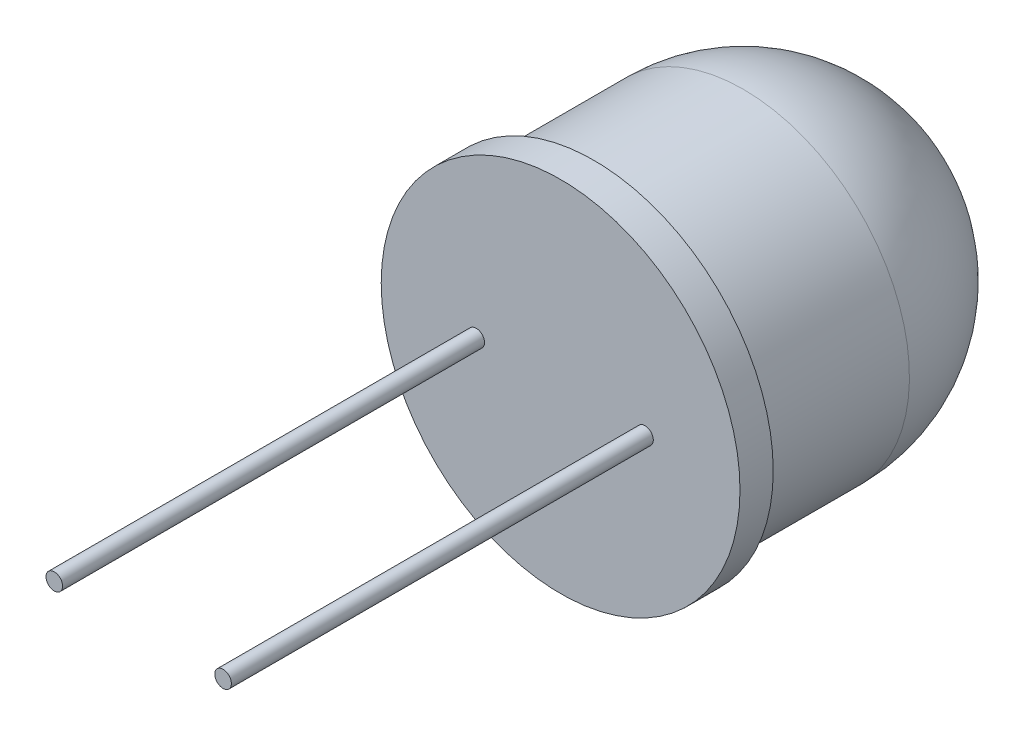
ISO-10303-21;
HEADER;
FILE_DESCRIPTION(('STEP AP214'),'2;1');
FILE_NAME('part.step','',(''),(''),'','','');
FILE_SCHEMA(('AUTOMOTIVE_DESIGN { 1 0 10303 214 1 1 1 1 }'));
ENDSEC;
DATA;
#1=APPLICATION_CONTEXT('core data for automotive mechanical design processes');
#2=APPLICATION_PROTOCOL_DEFINITION('international standard','automotive_design',2000,#1);
#3=PRODUCT_CONTEXT('',#1,'mechanical');
#4=PRODUCT('Part','Part','',(#3));
#5=PRODUCT_RELATED_PRODUCT_CATEGORY('part','',(#4));
#6=PRODUCT_DEFINITION_FORMATION('','',#4);
#7=PRODUCT_DEFINITION_CONTEXT('part definition',#1,'design');
#8=PRODUCT_DEFINITION('design','',#6,#7);
#9=PRODUCT_DEFINITION_SHAPE('','',#8);
#10=(LENGTH_UNIT() NAMED_UNIT(*) SI_UNIT(.MILLI.,.METRE.));
#11=(NAMED_UNIT(*) PLANE_ANGLE_UNIT() SI_UNIT($,.RADIAN.));
#12=(NAMED_UNIT(*) SI_UNIT($,.STERADIAN.) SOLID_ANGLE_UNIT());
#13=UNCERTAINTY_MEASURE_WITH_UNIT(LENGTH_MEASURE(1.E-05),#10,'distance_accuracy_value','');
#14=(GEOMETRIC_REPRESENTATION_CONTEXT(3) GLOBAL_UNCERTAINTY_ASSIGNED_CONTEXT((#13)) GLOBAL_UNIT_ASSIGNED_CONTEXT((#10,
#11,#12)) REPRESENTATION_CONTEXT('',''));
#15=CARTESIAN_POINT('',(0.,0.,0.));
#16=DIRECTION('',(0.,0.,1.));
#17=DIRECTION('',(1.,0.,0.));
#18=AXIS2_PLACEMENT_3D('',#15,#16,#17);
#19=CARTESIAN_POINT('',(0.,0.,5.5));
#20=DIRECTION('',(0.,0.,-1.));
#21=DIRECTION('',(-1.,0.,0.));
#22=AXIS2_PLACEMENT_3D('',#19,#20,#21);
#23=CYLINDRICAL_SURFACE('',#22,5.);
#24=CARTESIAN_POINT('',(0.,0.,0.));
#25=DIRECTION('',(0.,0.,-1.));
#26=DIRECTION('',(0.,1.,0.));
#27=AXIS2_PLACEMENT_3D('',#24,#25,#26);
#28=CIRCLE('',#27,5.);
#29=CARTESIAN_POINT('',(0.,5.,0.));
#30=VERTEX_POINT('',#29);
#31=EDGE_CURVE('E59',#30,#30,#28,.T.);
#32=ORIENTED_EDGE('',*,*,#31,.F.);
#33=EDGE_LOOP('',(#32));
#34=FACE_BOUND('',#33,.T.);
#35=CARTESIAN_POINT('',(0.,0.,4.5));
#36=DIRECTION('',(0.,0.,1.));
#37=DIRECTION('',(1.,0.,0.));
#38=AXIS2_PLACEMENT_3D('',#35,#36,#37);
#39=CIRCLE('',#38,5.);
#40=CARTESIAN_POINT('',(5.,0.,4.5));
#41=VERTEX_POINT('',#40);
#42=EDGE_CURVE('E41',#41,#41,#39,.T.);
#43=ORIENTED_EDGE('',*,*,#42,.F.);
#44=EDGE_LOOP('',(#43));
#45=FACE_BOUND('',#44,.T.);
#46=ADVANCED_FACE('F31',(#34,#45),#23,.T.);
#47=CARTESIAN_POINT('',(0.,0.,4.5));
#48=DIRECTION('',(0.,0.,1.));
#49=DIRECTION('',(1.,0.,0.));
#50=AXIS2_PLACEMENT_3D('',#47,#48,#49);
#51=PLANE('',#50);
#52=CARTESIAN_POINT('',(0.,0.,4.5));
#53=DIRECTION('',(0.,0.,1.));
#54=DIRECTION('',(1.,0.,0.));
#55=AXIS2_PLACEMENT_3D('',#52,#53,#54);
#56=CIRCLE('',#55,5.4);
#57=CARTESIAN_POINT('',(5.4,0.,4.5));
#58=VERTEX_POINT('',#57);
#59=EDGE_CURVE('E45',#58,#58,#56,.T.);
#60=ORIENTED_EDGE('',*,*,#59,.F.);
#61=EDGE_LOOP('',(#60));
#62=FACE_BOUND('',#61,.T.);
#63=ORIENTED_EDGE('',*,*,#42,.T.);
#64=EDGE_LOOP('',(#63));
#65=FACE_BOUND('',#64,.T.);
#66=ADVANCED_FACE('F67',(#62,#65),#51,.F.);
#67=CARTESIAN_POINT('',(0.,0.,4.5));
#68=DIRECTION('',(0.,0.,1.));
#69=DIRECTION('',(1.,0.,0.));
#70=AXIS2_PLACEMENT_3D('',#67,#68,#69);
#71=CYLINDRICAL_SURFACE('',#70,5.4);
#72=ORIENTED_EDGE('',*,*,#59,.T.);
#73=EDGE_LOOP('',(#72));
#74=FACE_BOUND('',#73,.T.);
#75=CARTESIAN_POINT('',(0.,0.,5.5));
#76=DIRECTION('',(0.,0.,1.));
#77=DIRECTION('',(1.,0.,0.));
#78=AXIS2_PLACEMENT_3D('',#75,#76,#77);
#79=CIRCLE('',#78,5.4);
#80=CARTESIAN_POINT('',(5.4,0.,5.5));
#81=VERTEX_POINT('',#80);
#82=EDGE_CURVE('E48',#81,#81,#79,.T.);
#83=ORIENTED_EDGE('',*,*,#82,.F.);
#84=EDGE_LOOP('',(#83));
#85=FACE_BOUND('',#84,.T.);
#86=ADVANCED_FACE('F71',(#74,#85),#71,.T.);
#87=CARTESIAN_POINT('',(0.,0.,5.5));
#88=DIRECTION('',(0.,0.,1.));
#89=DIRECTION('',(1.,0.,0.));
#90=AXIS2_PLACEMENT_3D('',#87,#88,#89);
#91=PLANE('',#90);
#92=CARTESIAN_POINT('',(-2.54,0.,5.5));
#93=DIRECTION('',(0.,0.,1.));
#94=DIRECTION('',(1.,0.,0.));
#95=AXIS2_PLACEMENT_3D('',#92,#93,#94);
#96=CIRCLE('',#95,0.25);
#97=CARTESIAN_POINT('',(-2.29,0.,5.5));
#98=VERTEX_POINT('',#97);
#99=EDGE_CURVE('E10',#98,#98,#96,.T.);
#100=ORIENTED_EDGE('',*,*,#99,.F.);
#101=EDGE_LOOP('',(#100));
#102=FACE_BOUND('',#101,.T.);
#103=CARTESIAN_POINT('',(2.54,0.,5.5));
#104=DIRECTION('',(0.,0.,1.));
#105=DIRECTION('',(1.,0.,0.));
#106=AXIS2_PLACEMENT_3D('',#103,#104,#105);
#107=CIRCLE('',#106,0.25);
#108=CARTESIAN_POINT('',(2.79,0.,5.5));
#109=VERTEX_POINT('',#108);
#110=EDGE_CURVE('E37',#109,#109,#107,.T.);
#111=ORIENTED_EDGE('',*,*,#110,.F.);
#112=EDGE_LOOP('',(#111));
#113=FACE_BOUND('',#112,.T.);
#114=ORIENTED_EDGE('',*,*,#82,.T.);
#115=EDGE_LOOP('',(#114));
#116=FACE_BOUND('',#115,.T.);
#117=ADVANCED_FACE('F77',(#102,#113,#116),#91,.T.);
#118=CARTESIAN_POINT('',(2.54,0.,18.2));
#119=DIRECTION('',(0.,0.,-1.));
#120=DIRECTION('',(-1.,0.,0.));
#121=AXIS2_PLACEMENT_3D('',#118,#119,#120);
#122=CYLINDRICAL_SURFACE('',#121,0.25);
#123=CARTESIAN_POINT('',(2.54,0.,18.2));
#124=DIRECTION('',(0.,0.,-1.));
#125=DIRECTION('',(-1.,0.,0.));
#126=AXIS2_PLACEMENT_3D('',#123,#124,#125);
#127=CIRCLE('',#126,0.25);
#128=CARTESIAN_POINT('',(2.29,0.,18.2));
#129=VERTEX_POINT('',#128);
#130=EDGE_CURVE('E51',#129,#129,#127,.T.);
#131=ORIENTED_EDGE('',*,*,#130,.T.);
#132=EDGE_LOOP('',(#131));
#133=FACE_BOUND('',#132,.T.);
#134=ORIENTED_EDGE('',*,*,#110,.T.);
#135=EDGE_LOOP('',(#134));
#136=FACE_BOUND('',#135,.T.);
#137=ADVANCED_FACE('F82',(#133,#136),#122,.T.);
#138=CARTESIAN_POINT('',(2.54,0.,18.2));
#139=DIRECTION('',(0.,0.,-1.));
#140=DIRECTION('',(-1.,0.,0.));
#141=AXIS2_PLACEMENT_3D('',#138,#139,#140);
#142=PLANE('',#141);
#143=ORIENTED_EDGE('',*,*,#130,.F.);
#144=EDGE_LOOP('',(#143));
#145=FACE_BOUND('',#144,.T.);
#146=ADVANCED_FACE('F89',(#145),#142,.F.);
#147=CARTESIAN_POINT('',(-2.54,0.,18.2));
#148=DIRECTION('',(0.,0.,-1.));
#149=DIRECTION('',(-1.,0.,0.));
#150=AXIS2_PLACEMENT_3D('',#147,#148,#149);
#151=CYLINDRICAL_SURFACE('',#150,0.25);
#152=CARTESIAN_POINT('',(-2.54,0.,18.2));
#153=DIRECTION('',(0.,0.,-1.));
#154=DIRECTION('',(1.,0.,0.));
#155=AXIS2_PLACEMENT_3D('',#152,#153,#154);
#156=CIRCLE('',#155,0.25);
#157=CARTESIAN_POINT('',(-2.29,0.,18.2));
#158=VERTEX_POINT('',#157);
#159=EDGE_CURVE('E56',#158,#158,#156,.T.);
#160=ORIENTED_EDGE('',*,*,#159,.T.);
#161=EDGE_LOOP('',(#160));
#162=FACE_BOUND('',#161,.T.);
#163=ORIENTED_EDGE('',*,*,#99,.T.);
#164=EDGE_LOOP('',(#163));
#165=FACE_BOUND('',#164,.T.);
#166=ADVANCED_FACE('F98',(#162,#165),#151,.T.);
#167=CARTESIAN_POINT('',(-2.54,0.,18.2));
#168=DIRECTION('',(0.,0.,1.));
#169=DIRECTION('',(1.,0.,0.));
#170=AXIS2_PLACEMENT_3D('',#167,#168,#169);
#171=PLANE('',#170);
#172=ORIENTED_EDGE('',*,*,#159,.F.);
#173=EDGE_LOOP('',(#172));
#174=FACE_BOUND('',#173,.T.);
#175=ADVANCED_FACE('F104',(#174),#171,.T.);
#176=CARTESIAN_POINT('',(0.,0.,0.));
#177=DIRECTION('',(0.,0.,-1.));
#178=DIRECTION('',(0.,1.,0.));
#179=AXIS2_PLACEMENT_3D('',#176,#177,#178);
#180=SPHERICAL_SURFACE('',#179,5.);
#181=ORIENTED_EDGE('',*,*,#31,.T.);
#182=EDGE_LOOP('',(#181));
#183=FACE_BOUND('',#182,.T.);
#184=ADVANCED_FACE('F63',(#183),#180,.T.);
#185=CLOSED_SHELL('',(#46,#66,#86,#117,#137,#146,#166,#175,#184));
#186=MANIFOLD_SOLID_BREP('B2',#185);
#187=ADVANCED_BREP_SHAPE_REPRESENTATION('',(#18,#186),#14);
#188=SHAPE_DEFINITION_REPRESENTATION(#9,#187);
ENDSEC;
END-ISO-10303-21;
